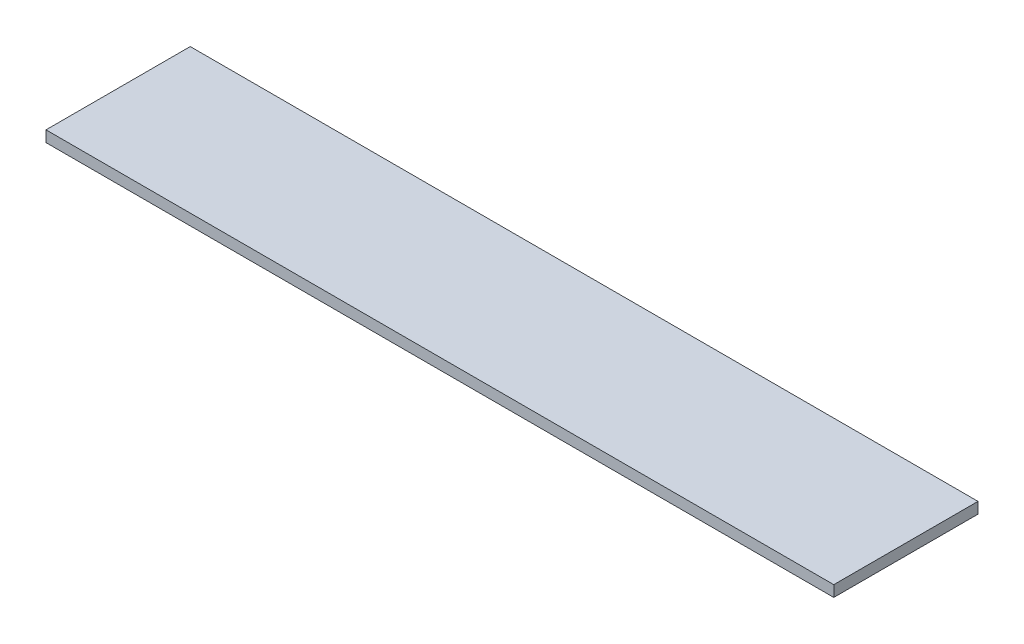
ISO-10303-21;
HEADER;
FILE_DESCRIPTION(('STEP AP214'),'2;1');
FILE_NAME('part.step','',(''),(''),'','','');
FILE_SCHEMA(('AUTOMOTIVE_DESIGN { 1 0 10303 214 1 1 1 1 }'));
ENDSEC;
DATA;
#1=APPLICATION_CONTEXT('core data for automotive mechanical design processes');
#2=APPLICATION_PROTOCOL_DEFINITION('international standard','automotive_design',2000,#1);
#3=PRODUCT_CONTEXT('',#1,'mechanical');
#4=PRODUCT('Part','Part','',(#3));
#5=PRODUCT_RELATED_PRODUCT_CATEGORY('part','',(#4));
#6=PRODUCT_DEFINITION_FORMATION('','',#4);
#7=PRODUCT_DEFINITION_CONTEXT('part definition',#1,'design');
#8=PRODUCT_DEFINITION('design','',#6,#7);
#9=PRODUCT_DEFINITION_SHAPE('','',#8);
#10=(LENGTH_UNIT() NAMED_UNIT(*) SI_UNIT(.MILLI.,.METRE.));
#11=(NAMED_UNIT(*) PLANE_ANGLE_UNIT() SI_UNIT($,.RADIAN.));
#12=(NAMED_UNIT(*) SI_UNIT($,.STERADIAN.) SOLID_ANGLE_UNIT());
#13=UNCERTAINTY_MEASURE_WITH_UNIT(LENGTH_MEASURE(1.E-05),#10,'distance_accuracy_value','');
#14=(GEOMETRIC_REPRESENTATION_CONTEXT(3) GLOBAL_UNCERTAINTY_ASSIGNED_CONTEXT((#13)) GLOBAL_UNIT_ASSIGNED_CONTEXT((#10,
#11,#12)) REPRESENTATION_CONTEXT('',''));
#15=CARTESIAN_POINT('',(0.,0.,0.));
#16=DIRECTION('',(0.,0.,1.));
#17=DIRECTION('',(1.,0.,0.));
#18=AXIS2_PLACEMENT_3D('',#15,#16,#17);
#19=CARTESIAN_POINT('',(-28.3111111111111,8.85555555555553,6.75));
#20=DIRECTION('',(1.,0.,0.));
#21=DIRECTION('',(0.,1.,0.));
#22=AXIS2_PLACEMENT_3D('',#19,#20,#21);
#23=PLANE('',#22);
#24=DIRECTION('',(0.,0.,-1.));
#25=VECTOR('',#24,1.);
#26=CARTESIAN_POINT('',(-28.3111111111111,9.85555555555553,6.75));
#27=LINE('',#26,#25);
#28=CARTESIAN_POINT('',(-28.3111111111111,9.85555555555553,6.75));
#29=VERTEX_POINT('',#28);
#30=CARTESIAN_POINT('',(-28.3111111111111,9.85555555555557,-6.25));
#31=VERTEX_POINT('',#30);
#32=EDGE_CURVE('E98',#29,#31,#27,.T.);
#33=ORIENTED_EDGE('',*,*,#32,.T.);
#34=DIRECTION('',(0.,1.,0.));
#35=VECTOR('',#34,1.);
#36=CARTESIAN_POINT('',(-28.3111111111111,8.85555555555557,-6.25));
#37=LINE('',#36,#35);
#38=CARTESIAN_POINT('',(-28.3111111111111,8.85555555555557,-6.25));
#39=VERTEX_POINT('',#38);
#40=EDGE_CURVE('E11',#39,#31,#37,.T.);
#41=ORIENTED_EDGE('',*,*,#40,.F.);
#42=DIRECTION('',(0.,0.,-1.));
#43=VECTOR('',#42,1.);
#44=CARTESIAN_POINT('',(-28.3111111111111,8.85555555555553,6.75));
#45=LINE('',#44,#43);
#46=CARTESIAN_POINT('',(-28.3111111111111,8.85555555555553,6.75));
#47=VERTEX_POINT('',#46);
#48=EDGE_CURVE('E86',#47,#39,#45,.T.);
#49=ORIENTED_EDGE('',*,*,#48,.F.);
#50=DIRECTION('',(0.,1.,0.));
#51=VECTOR('',#50,1.);
#52=CARTESIAN_POINT('',(-28.3111111111111,8.85555555555553,6.75));
#53=LINE('',#52,#51);
#54=EDGE_CURVE('E94',#47,#29,#53,.T.);
#55=ORIENTED_EDGE('',*,*,#54,.T.);
#56=EDGE_LOOP('',(#33,#41,#49,#55));
#57=FACE_BOUND('',#56,.T.);
#58=ADVANCED_FACE('F35',(#57),#23,.F.);
#59=CARTESIAN_POINT('',(-28.3111111111111,8.85555555555557,-6.25));
#60=DIRECTION('',(0.,0.,1.));
#61=DIRECTION('',(-1.,0.,0.));
#62=AXIS2_PLACEMENT_3D('',#59,#60,#61);
#63=PLANE('',#62);
#64=DIRECTION('',(1.,0.,0.));
#65=VECTOR('',#64,1.);
#66=CARTESIAN_POINT('',(-28.3111111111111,9.85555555555557,-6.25));
#67=LINE('',#66,#65);
#68=CARTESIAN_POINT('',(42.6888888888889,9.85555555555557,-6.25));
#69=VERTEX_POINT('',#68);
#70=EDGE_CURVE('E90',#31,#69,#67,.T.);
#71=ORIENTED_EDGE('',*,*,#70,.T.);
#72=DIRECTION('',(0.,1.,0.));
#73=VECTOR('',#72,1.);
#74=CARTESIAN_POINT('',(42.6888888888889,8.85555555555557,-6.25));
#75=LINE('',#74,#73);
#76=CARTESIAN_POINT('',(42.6888888888889,8.85555555555557,-6.25));
#77=VERTEX_POINT('',#76);
#78=EDGE_CURVE('E43',#77,#69,#75,.T.);
#79=ORIENTED_EDGE('',*,*,#78,.F.);
#80=DIRECTION('',(1.,0.,0.));
#81=VECTOR('',#80,1.);
#82=CARTESIAN_POINT('',(-28.3111111111111,8.85555555555557,-6.25));
#83=LINE('',#82,#81);
#84=EDGE_CURVE('E81',#39,#77,#83,.T.);
#85=ORIENTED_EDGE('',*,*,#84,.F.);
#86=ORIENTED_EDGE('',*,*,#40,.T.);
#87=EDGE_LOOP('',(#71,#79,#85,#86));
#88=FACE_BOUND('',#87,.T.);
#89=ADVANCED_FACE('F89',(#88),#63,.F.);
#90=CARTESIAN_POINT('',(42.6888888888889,8.85555555555553,6.75));
#91=DIRECTION('',(-1.,0.,0.));
#92=DIRECTION('',(0.,-1.,0.));
#93=AXIS2_PLACEMENT_3D('',#90,#91,#92);
#94=PLANE('',#93);
#95=DIRECTION('',(0.,0.,1.));
#96=VECTOR('',#95,1.);
#97=CARTESIAN_POINT('',(42.6888888888889,9.85555555555553,6.75));
#98=LINE('',#97,#96);
#99=CARTESIAN_POINT('',(42.6888888888889,9.85555555555553,6.75));
#100=VERTEX_POINT('',#99);
#101=EDGE_CURVE('E68',#69,#100,#98,.T.);
#102=ORIENTED_EDGE('',*,*,#101,.T.);
#103=DIRECTION('',(0.,1.,0.));
#104=VECTOR('',#103,1.);
#105=CARTESIAN_POINT('',(42.6888888888889,8.85555555555553,6.75));
#106=LINE('',#105,#104);
#107=CARTESIAN_POINT('',(42.6888888888889,8.85555555555553,6.75));
#108=VERTEX_POINT('',#107);
#109=EDGE_CURVE('E91',#108,#100,#106,.T.);
#110=ORIENTED_EDGE('',*,*,#109,.F.);
#111=DIRECTION('',(0.,0.,1.));
#112=VECTOR('',#111,1.);
#113=CARTESIAN_POINT('',(42.6888888888889,8.85555555555553,6.75));
#114=LINE('',#113,#112);
#115=EDGE_CURVE('E84',#77,#108,#114,.T.);
#116=ORIENTED_EDGE('',*,*,#115,.F.);
#117=ORIENTED_EDGE('',*,*,#78,.T.);
#118=EDGE_LOOP('',(#102,#110,#116,#117));
#119=FACE_BOUND('',#118,.T.);
#120=ADVANCED_FACE('F92',(#119),#94,.F.);
#121=CARTESIAN_POINT('',(-28.3111111111111,8.85555555555553,6.75));
#122=DIRECTION('',(0.,0.,-1.));
#123=DIRECTION('',(0.,1.,0.));
#124=AXIS2_PLACEMENT_3D('',#121,#122,#123);
#125=PLANE('',#124);
#126=DIRECTION('',(-1.,0.,0.));
#127=VECTOR('',#126,1.);
#128=CARTESIAN_POINT('',(-28.3111111111111,9.85555555555553,6.75));
#129=LINE('',#128,#127);
#130=EDGE_CURVE('E74',#100,#29,#129,.T.);
#131=ORIENTED_EDGE('',*,*,#130,.T.);
#132=ORIENTED_EDGE('',*,*,#54,.F.);
#133=DIRECTION('',(-1.,0.,0.));
#134=VECTOR('',#133,1.);
#135=CARTESIAN_POINT('',(-28.3111111111111,8.85555555555553,6.75));
#136=LINE('',#135,#134);
#137=EDGE_CURVE('E51',#108,#47,#136,.T.);
#138=ORIENTED_EDGE('',*,*,#137,.F.);
#139=ORIENTED_EDGE('',*,*,#109,.T.);
#140=EDGE_LOOP('',(#131,#132,#138,#139));
#141=FACE_BOUND('',#140,.T.);
#142=ADVANCED_FACE('F105',(#141),#125,.F.);
#143=CARTESIAN_POINT('',(0.,8.85555555555558,-9.35555555555555));
#144=DIRECTION('',(0.,-1.,0.));
#145=DIRECTION('',(1.,0.,0.));
#146=AXIS2_PLACEMENT_3D('',#143,#144,#145);
#147=PLANE('',#146);
#148=ORIENTED_EDGE('',*,*,#48,.T.);
#149=ORIENTED_EDGE('',*,*,#84,.T.);
#150=ORIENTED_EDGE('',*,*,#115,.T.);
#151=ORIENTED_EDGE('',*,*,#137,.T.);
#152=EDGE_LOOP('',(#148,#149,#150,#151));
#153=FACE_BOUND('',#152,.T.);
#154=ADVANCED_FACE('F82',(#153),#147,.T.);
#155=CARTESIAN_POINT('',(0.,9.85555555555558,-9.35555555555555));
#156=DIRECTION('',(0.,-1.,0.));
#157=DIRECTION('',(1.,0.,0.));
#158=AXIS2_PLACEMENT_3D('',#155,#156,#157);
#159=PLANE('',#158);
#160=ORIENTED_EDGE('',*,*,#32,.F.);
#161=ORIENTED_EDGE('',*,*,#130,.F.);
#162=ORIENTED_EDGE('',*,*,#101,.F.);
#163=ORIENTED_EDGE('',*,*,#70,.F.);
#164=EDGE_LOOP('',(#160,#161,#162,#163));
#165=FACE_BOUND('',#164,.T.);
#166=ADVANCED_FACE('F108',(#165),#159,.F.);
#167=CLOSED_SHELL('',(#58,#89,#120,#142,#154,#166));
#168=MANIFOLD_SOLID_BREP('B2',#167);
#169=ADVANCED_BREP_SHAPE_REPRESENTATION('',(#18,#168),#14);
#170=SHAPE_DEFINITION_REPRESENTATION(#9,#169);
ENDSEC;
END-ISO-10303-21;
